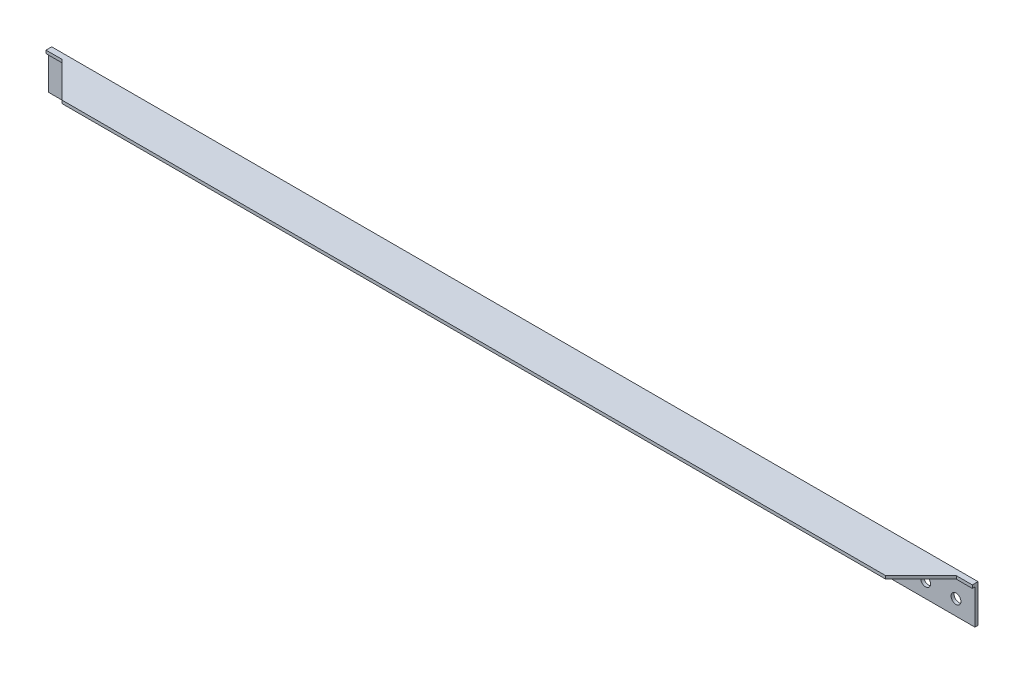
ISO-10303-21;
HEADER;
FILE_DESCRIPTION(('STEP AP214'),'2;1');
FILE_NAME('part.step','',(''),(''),'','','');
FILE_SCHEMA(('AUTOMOTIVE_DESIGN { 1 0 10303 214 1 1 1 1 }'));
ENDSEC;
DATA;
#1=APPLICATION_CONTEXT('core data for automotive mechanical design processes');
#2=APPLICATION_PROTOCOL_DEFINITION('international standard','automotive_design',2000,#1);
#3=PRODUCT_CONTEXT('',#1,'mechanical');
#4=PRODUCT('Part','Part','',(#3));
#5=PRODUCT_RELATED_PRODUCT_CATEGORY('part','',(#4));
#6=PRODUCT_DEFINITION_FORMATION('','',#4);
#7=PRODUCT_DEFINITION_CONTEXT('part definition',#1,'design');
#8=PRODUCT_DEFINITION('design','',#6,#7);
#9=PRODUCT_DEFINITION_SHAPE('','',#8);
#10=(LENGTH_UNIT() NAMED_UNIT(*) SI_UNIT(.MILLI.,.METRE.));
#11=(NAMED_UNIT(*) PLANE_ANGLE_UNIT() SI_UNIT($,.RADIAN.));
#12=(NAMED_UNIT(*) SI_UNIT($,.STERADIAN.) SOLID_ANGLE_UNIT());
#13=UNCERTAINTY_MEASURE_WITH_UNIT(LENGTH_MEASURE(1.E-05),#10,'distance_accuracy_value','');
#14=(GEOMETRIC_REPRESENTATION_CONTEXT(3) GLOBAL_UNCERTAINTY_ASSIGNED_CONTEXT((#13)) GLOBAL_UNIT_ASSIGNED_CONTEXT((#10,
#11,#12)) REPRESENTATION_CONTEXT('',''));
#15=CARTESIAN_POINT('',(0.,0.,0.));
#16=DIRECTION('',(0.,0.,1.));
#17=DIRECTION('',(1.,0.,0.));
#18=AXIS2_PLACEMENT_3D('',#15,#16,#17);
#19=CARTESIAN_POINT('',(-1220.,100.,8.));
#20=DIRECTION('',(0.,0.,-1.));
#21=DIRECTION('',(-1.,0.,0.));
#22=AXIS2_PLACEMENT_3D('',#19,#20,#21);
#23=PLANE('',#22);
#24=CARTESIAN_POINT('',(-80.,39.9999999999999,8.));
#25=DIRECTION('',(0.,0.,1.));
#26=DIRECTION('',(-1.,0.,0.));
#27=AXIS2_PLACEMENT_3D('',#24,#25,#26);
#28=CIRCLE('',#27,13.);
#29=CARTESIAN_POINT('',(-93.,39.9999999999999,8.));
#30=VERTEX_POINT('',#29);
#31=EDGE_CURVE('E144',#30,#30,#28,.T.);
#32=ORIENTED_EDGE('',*,*,#31,.F.);
#33=EDGE_LOOP('',(#32));
#34=FACE_BOUND('',#33,.T.);
#35=CARTESIAN_POINT('',(-160.,39.9999999999999,8.));
#36=DIRECTION('',(0.,0.,1.));
#37=DIRECTION('',(-1.,0.,0.));
#38=AXIS2_PLACEMENT_3D('',#35,#36,#37);
#39=CIRCLE('',#38,13.);
#40=CARTESIAN_POINT('',(-173.,39.9999999999999,8.));
#41=VERTEX_POINT('',#40);
#42=EDGE_CURVE('E150',#41,#41,#39,.T.);
#43=ORIENTED_EDGE('',*,*,#42,.F.);
#44=EDGE_LOOP('',(#43));
#45=FACE_BOUND('',#44,.T.);
#46=CARTESIAN_POINT('',(160.,39.9999999999999,8.));
#47=DIRECTION('',(0.,0.,1.));
#48=DIRECTION('',(1.,0.,0.));
#49=AXIS2_PLACEMENT_3D('',#46,#47,#48);
#50=CIRCLE('',#49,13.);
#51=CARTESIAN_POINT('',(173.,39.9999999999999,8.));
#52=VERTEX_POINT('',#51);
#53=EDGE_CURVE('E156',#52,#52,#50,.T.);
#54=ORIENTED_EDGE('',*,*,#53,.F.);
#55=EDGE_LOOP('',(#54));
#56=FACE_BOUND('',#55,.T.);
#57=CARTESIAN_POINT('',(80.,39.9999999999999,8.));
#58=DIRECTION('',(0.,0.,1.));
#59=DIRECTION('',(1.,0.,0.));
#60=AXIS2_PLACEMENT_3D('',#57,#58,#59);
#61=CIRCLE('',#60,13.);
#62=CARTESIAN_POINT('',(93.,39.9999999999999,8.));
#63=VERTEX_POINT('',#62);
#64=EDGE_CURVE('E162',#63,#63,#61,.T.);
#65=ORIENTED_EDGE('',*,*,#64,.F.);
#66=EDGE_LOOP('',(#65));
#67=FACE_BOUND('',#66,.T.);
#68=CARTESIAN_POINT('',(0.,39.9999999999999,8.));
#69=DIRECTION('',(0.,0.,1.));
#70=DIRECTION('',(1.,0.,0.));
#71=AXIS2_PLACEMENT_3D('',#68,#69,#70);
#72=CIRCLE('',#71,13.);
#73=CARTESIAN_POINT('',(13.,39.9999999999999,8.));
#74=VERTEX_POINT('',#73);
#75=EDGE_CURVE('E168',#74,#74,#72,.T.);
#76=ORIENTED_EDGE('',*,*,#75,.F.);
#77=EDGE_LOOP('',(#76));
#78=FACE_BOUND('',#77,.T.);
#79=CARTESIAN_POINT('',(-1090.,40.,8.));
#80=DIRECTION('',(0.,0.,1.));
#81=DIRECTION('',(-1.,0.,0.));
#82=AXIS2_PLACEMENT_3D('',#79,#80,#81);
#83=CIRCLE('',#82,12.9999999999998);
#84=CARTESIAN_POINT('',(-1103.,40.,8.));
#85=VERTEX_POINT('',#84);
#86=EDGE_CURVE('E174',#85,#85,#83,.T.);
#87=ORIENTED_EDGE('',*,*,#86,.F.);
#88=EDGE_LOOP('',(#87));
#89=FACE_BOUND('',#88,.T.);
#90=CARTESIAN_POINT('',(-1170.,40.,8.));
#91=DIRECTION('',(0.,0.,1.));
#92=DIRECTION('',(-1.,0.,0.));
#93=AXIS2_PLACEMENT_3D('',#90,#91,#92);
#94=CIRCLE('',#93,12.9999999999998);
#95=CARTESIAN_POINT('',(-1183.,40.,8.));
#96=VERTEX_POINT('',#95);
#97=EDGE_CURVE('E180',#96,#96,#94,.T.);
#98=ORIENTED_EDGE('',*,*,#97,.F.);
#99=EDGE_LOOP('',(#98));
#100=FACE_BOUND('',#99,.T.);
#101=CARTESIAN_POINT('',(1170.,40.,8.));
#102=DIRECTION('',(0.,0.,1.));
#103=DIRECTION('',(1.,0.,0.));
#104=AXIS2_PLACEMENT_3D('',#101,#102,#103);
#105=CIRCLE('',#104,12.9999999999998);
#106=CARTESIAN_POINT('',(1183.,40.,8.));
#107=VERTEX_POINT('',#106);
#108=EDGE_CURVE('E186',#107,#107,#105,.T.);
#109=ORIENTED_EDGE('',*,*,#108,.F.);
#110=EDGE_LOOP('',(#109));
#111=FACE_BOUND('',#110,.T.);
#112=CARTESIAN_POINT('',(1090.,40.,8.));
#113=DIRECTION('',(0.,0.,1.));
#114=DIRECTION('',(1.,0.,0.));
#115=AXIS2_PLACEMENT_3D('',#112,#113,#114);
#116=CIRCLE('',#115,12.9999999999998);
#117=CARTESIAN_POINT('',(1103.,40.,8.));
#118=VERTEX_POINT('',#117);
#119=EDGE_CURVE('E192',#118,#118,#116,.T.);
#120=ORIENTED_EDGE('',*,*,#119,.F.);
#121=EDGE_LOOP('',(#120));
#122=FACE_BOUND('',#121,.T.);
#123=DIRECTION('',(1.,0.,0.));
#124=VECTOR('',#123,1.);
#125=CARTESIAN_POINT('',(-1220.,92.,8.));
#126=LINE('',#125,#124);
#127=CARTESIAN_POINT('',(-1220.,92.,8.));
#128=VERTEX_POINT('',#127);
#129=CARTESIAN_POINT('',(1220.,92.,8.));
#130=VERTEX_POINT('',#129);
#131=EDGE_CURVE('E135',#128,#130,#126,.T.);
#132=ORIENTED_EDGE('',*,*,#131,.F.);
#133=DIRECTION('',(0.,-1.,0.));
#134=VECTOR('',#133,1.);
#135=CARTESIAN_POINT('',(-1220.,0.,8.));
#136=LINE('',#135,#134);
#137=CARTESIAN_POINT('',(-1220.,0.,8.));
#138=VERTEX_POINT('',#137);
#139=EDGE_CURVE('E198',#128,#138,#136,.T.);
#140=ORIENTED_EDGE('',*,*,#139,.T.);
#141=DIRECTION('',(1.,0.,0.));
#142=VECTOR('',#141,1.);
#143=CARTESIAN_POINT('',(-1220.,0.,8.));
#144=LINE('',#143,#142);
#145=CARTESIAN_POINT('',(1220.,0.,8.));
#146=VERTEX_POINT('',#145);
#147=EDGE_CURVE('E200',#138,#146,#144,.T.);
#148=ORIENTED_EDGE('',*,*,#147,.T.);
#149=DIRECTION('',(0.,1.,0.));
#150=VECTOR('',#149,1.);
#151=CARTESIAN_POINT('',(1220.,0.,8.));
#152=LINE('',#151,#150);
#153=EDGE_CURVE('E203',#146,#130,#152,.T.);
#154=ORIENTED_EDGE('',*,*,#153,.T.);
#155=EDGE_LOOP('',(#132,#140,#148,#154));
#156=FACE_BOUND('',#155,.T.);
#157=ADVANCED_FACE('F36',(#34,#45,#56,#67,#78,#89,#100,#111,#122,#156),#23,.F.);
#158=CARTESIAN_POINT('',(-1220.,100.,0.));
#159=DIRECTION('',(0.,0.,-1.));
#160=DIRECTION('',(-1.,0.,0.));
#161=AXIS2_PLACEMENT_3D('',#158,#159,#160);
#162=PLANE('',#161);
#163=CARTESIAN_POINT('',(-160.,39.9999999999999,0.));
#164=DIRECTION('',(0.,0.,1.));
#165=DIRECTION('',(-1.,0.,0.));
#166=AXIS2_PLACEMENT_3D('',#163,#164,#165);
#167=CIRCLE('',#166,13.);
#168=CARTESIAN_POINT('',(-173.,39.9999999999999,0.));
#169=VERTEX_POINT('',#168);
#170=EDGE_CURVE('E147',#169,#169,#167,.T.);
#171=ORIENTED_EDGE('',*,*,#170,.T.);
#172=EDGE_LOOP('',(#171));
#173=FACE_BOUND('',#172,.T.);
#174=CARTESIAN_POINT('',(80.,39.9999999999999,0.));
#175=DIRECTION('',(0.,0.,1.));
#176=DIRECTION('',(1.,0.,0.));
#177=AXIS2_PLACEMENT_3D('',#174,#175,#176);
#178=CIRCLE('',#177,13.);
#179=CARTESIAN_POINT('',(93.,39.9999999999999,0.));
#180=VERTEX_POINT('',#179);
#181=EDGE_CURVE('E159',#180,#180,#178,.T.);
#182=ORIENTED_EDGE('',*,*,#181,.T.);
#183=EDGE_LOOP('',(#182));
#184=FACE_BOUND('',#183,.T.);
#185=CARTESIAN_POINT('',(-1090.,40.,0.));
#186=DIRECTION('',(0.,0.,1.));
#187=DIRECTION('',(-1.,0.,0.));
#188=AXIS2_PLACEMENT_3D('',#185,#186,#187);
#189=CIRCLE('',#188,12.9999999999998);
#190=CARTESIAN_POINT('',(-1103.,40.,0.));
#191=VERTEX_POINT('',#190);
#192=EDGE_CURVE('E171',#191,#191,#189,.T.);
#193=ORIENTED_EDGE('',*,*,#192,.T.);
#194=EDGE_LOOP('',(#193));
#195=FACE_BOUND('',#194,.T.);
#196=CARTESIAN_POINT('',(1170.,40.,0.));
#197=DIRECTION('',(0.,0.,1.));
#198=DIRECTION('',(1.,0.,0.));
#199=AXIS2_PLACEMENT_3D('',#196,#197,#198);
#200=CIRCLE('',#199,12.9999999999998);
#201=CARTESIAN_POINT('',(1183.,40.,0.));
#202=VERTEX_POINT('',#201);
#203=EDGE_CURVE('E183',#202,#202,#200,.T.);
#204=ORIENTED_EDGE('',*,*,#203,.T.);
#205=EDGE_LOOP('',(#204));
#206=FACE_BOUND('',#205,.T.);
#207=DIRECTION('',(0.,-1.,0.));
#208=VECTOR('',#207,1.);
#209=CARTESIAN_POINT('',(-1220.,0.,0.));
#210=LINE('',#209,#208);
#211=CARTESIAN_POINT('',(-1220.,100.,0.));
#212=VERTEX_POINT('',#211);
#213=CARTESIAN_POINT('',(-1220.,0.,0.));
#214=VERTEX_POINT('',#213);
#215=EDGE_CURVE('E195',#212,#214,#210,.T.);
#216=ORIENTED_EDGE('',*,*,#215,.F.);
#217=DIRECTION('',(-1.,0.,0.));
#218=VECTOR('',#217,1.);
#219=CARTESIAN_POINT('',(-1220.,100.,0.));
#220=LINE('',#219,#218);
#221=CARTESIAN_POINT('',(1220.,100.,0.));
#222=VERTEX_POINT('',#221);
#223=EDGE_CURVE('E201',#222,#212,#220,.T.);
#224=ORIENTED_EDGE('',*,*,#223,.F.);
#225=DIRECTION('',(0.,1.,0.));
#226=VECTOR('',#225,1.);
#227=CARTESIAN_POINT('',(1220.,0.,0.));
#228=LINE('',#227,#226);
#229=CARTESIAN_POINT('',(1220.,0.,0.));
#230=VERTEX_POINT('',#229);
#231=EDGE_CURVE('E211',#230,#222,#228,.T.);
#232=ORIENTED_EDGE('',*,*,#231,.F.);
#233=DIRECTION('',(1.,0.,0.));
#234=VECTOR('',#233,1.);
#235=CARTESIAN_POINT('',(-1220.,0.,0.));
#236=LINE('',#235,#234);
#237=EDGE_CURVE('E209',#214,#230,#236,.T.);
#238=ORIENTED_EDGE('',*,*,#237,.F.);
#239=EDGE_LOOP('',(#216,#224,#232,#238));
#240=FACE_BOUND('',#239,.T.);
#241=CARTESIAN_POINT('',(1090.,40.,0.));
#242=DIRECTION('',(0.,0.,1.));
#243=DIRECTION('',(1.,0.,0.));
#244=AXIS2_PLACEMENT_3D('',#241,#242,#243);
#245=CIRCLE('',#244,12.9999999999998);
#246=CARTESIAN_POINT('',(1103.,40.,0.));
#247=VERTEX_POINT('',#246);
#248=EDGE_CURVE('E189',#247,#247,#245,.T.);
#249=ORIENTED_EDGE('',*,*,#248,.T.);
#250=EDGE_LOOP('',(#249));
#251=FACE_BOUND('',#250,.T.);
#252=CARTESIAN_POINT('',(-1170.,40.,0.));
#253=DIRECTION('',(0.,0.,1.));
#254=DIRECTION('',(-1.,0.,0.));
#255=AXIS2_PLACEMENT_3D('',#252,#253,#254);
#256=CIRCLE('',#255,12.9999999999998);
#257=CARTESIAN_POINT('',(-1183.,40.,0.));
#258=VERTEX_POINT('',#257);
#259=EDGE_CURVE('E177',#258,#258,#256,.T.);
#260=ORIENTED_EDGE('',*,*,#259,.T.);
#261=EDGE_LOOP('',(#260));
#262=FACE_BOUND('',#261,.T.);
#263=CARTESIAN_POINT('',(0.,39.9999999999999,0.));
#264=DIRECTION('',(0.,0.,1.));
#265=DIRECTION('',(1.,0.,0.));
#266=AXIS2_PLACEMENT_3D('',#263,#264,#265);
#267=CIRCLE('',#266,13.);
#268=CARTESIAN_POINT('',(13.,39.9999999999999,0.));
#269=VERTEX_POINT('',#268);
#270=EDGE_CURVE('E165',#269,#269,#267,.T.);
#271=ORIENTED_EDGE('',*,*,#270,.T.);
#272=EDGE_LOOP('',(#271));
#273=FACE_BOUND('',#272,.T.);
#274=CARTESIAN_POINT('',(160.,39.9999999999999,0.));
#275=DIRECTION('',(0.,0.,1.));
#276=DIRECTION('',(1.,0.,0.));
#277=AXIS2_PLACEMENT_3D('',#274,#275,#276);
#278=CIRCLE('',#277,13.);
#279=CARTESIAN_POINT('',(173.,39.9999999999999,0.));
#280=VERTEX_POINT('',#279);
#281=EDGE_CURVE('E153',#280,#280,#278,.T.);
#282=ORIENTED_EDGE('',*,*,#281,.T.);
#283=EDGE_LOOP('',(#282));
#284=FACE_BOUND('',#283,.T.);
#285=CARTESIAN_POINT('',(-80.,39.9999999999999,0.));
#286=DIRECTION('',(0.,0.,1.));
#287=DIRECTION('',(-1.,0.,0.));
#288=AXIS2_PLACEMENT_3D('',#285,#286,#287);
#289=CIRCLE('',#288,13.);
#290=CARTESIAN_POINT('',(-93.,39.9999999999999,0.));
#291=VERTEX_POINT('',#290);
#292=EDGE_CURVE('E143',#291,#291,#289,.T.);
#293=ORIENTED_EDGE('',*,*,#292,.T.);
#294=EDGE_LOOP('',(#293));
#295=FACE_BOUND('',#294,.T.);
#296=ADVANCED_FACE('F264',(#173,#184,#195,#206,#240,#251,#262,#273,#284,#295),#162,.T.);
#297=CARTESIAN_POINT('',(-1220.,0.,8.));
#298=DIRECTION('',(1.,0.,0.));
#299=DIRECTION('',(0.,0.,-1.));
#300=AXIS2_PLACEMENT_3D('',#297,#298,#299);
#301=PLANE('',#300);
#302=DIRECTION('',(0.,0.,-1.));
#303=VECTOR('',#302,1.);
#304=CARTESIAN_POINT('',(-1220.,92.,108.));
#305=LINE('',#304,#303);
#306=CARTESIAN_POINT('',(-1220.,92.,15.));
#307=VERTEX_POINT('',#306);
#308=EDGE_CURVE('E133',#307,#128,#305,.T.);
#309=ORIENTED_EDGE('',*,*,#308,.F.);
#310=DIRECTION('',(0.,1.,0.));
#311=VECTOR('',#310,1.);
#312=CARTESIAN_POINT('',(-1220.,0.,15.));
#313=LINE('',#312,#311);
#314=CARTESIAN_POINT('',(-1220.,100.,15.));
#315=VERTEX_POINT('',#314);
#316=EDGE_CURVE('E250',#307,#315,#313,.T.);
#317=ORIENTED_EDGE('',*,*,#316,.T.);
#318=DIRECTION('',(0.,0.,-1.));
#319=VECTOR('',#318,1.);
#320=CARTESIAN_POINT('',(-1220.,100.,8.));
#321=LINE('',#320,#319);
#322=EDGE_CURVE('E206',#315,#212,#321,.T.);
#323=ORIENTED_EDGE('',*,*,#322,.T.);
#324=ORIENTED_EDGE('',*,*,#215,.T.);
#325=DIRECTION('',(0.,0.,-1.));
#326=VECTOR('',#325,1.);
#327=CARTESIAN_POINT('',(-1220.,0.,8.));
#328=LINE('',#327,#326);
#329=EDGE_CURVE('E222',#138,#214,#328,.T.);
#330=ORIENTED_EDGE('',*,*,#329,.F.);
#331=ORIENTED_EDGE('',*,*,#139,.F.);
#332=EDGE_LOOP('',(#309,#317,#323,#324,#330,#331));
#333=FACE_BOUND('',#332,.T.);
#334=ADVANCED_FACE('F38',(#333),#301,.F.);
#335=CARTESIAN_POINT('',(-1220.,0.,8.));
#336=DIRECTION('',(0.,1.,0.));
#337=DIRECTION('',(0.,0.,1.));
#338=AXIS2_PLACEMENT_3D('',#335,#336,#337);
#339=PLANE('',#338);
#340=ORIENTED_EDGE('',*,*,#237,.T.);
#341=DIRECTION('',(0.,0.,-1.));
#342=VECTOR('',#341,1.);
#343=CARTESIAN_POINT('',(1220.,0.,8.));
#344=LINE('',#343,#342);
#345=EDGE_CURVE('E219',#146,#230,#344,.T.);
#346=ORIENTED_EDGE('',*,*,#345,.F.);
#347=ORIENTED_EDGE('',*,*,#147,.F.);
#348=ORIENTED_EDGE('',*,*,#329,.T.);
#349=EDGE_LOOP('',(#340,#346,#347,#348));
#350=FACE_BOUND('',#349,.T.);
#351=ADVANCED_FACE('F269',(#350),#339,.F.);
#352=CARTESIAN_POINT('',(1220.,0.,8.));
#353=DIRECTION('',(-1.,0.,0.));
#354=DIRECTION('',(0.,0.,1.));
#355=AXIS2_PLACEMENT_3D('',#352,#353,#354);
#356=PLANE('',#355);
#357=DIRECTION('',(0.,0.,-1.));
#358=VECTOR('',#357,1.);
#359=CARTESIAN_POINT('',(1220.,100.,8.));
#360=LINE('',#359,#358);
#361=CARTESIAN_POINT('',(1220.,100.,15.));
#362=VERTEX_POINT('',#361);
#363=EDGE_CURVE('E217',#362,#222,#360,.T.);
#364=ORIENTED_EDGE('',*,*,#363,.F.);
#365=DIRECTION('',(0.,1.,0.));
#366=VECTOR('',#365,1.);
#367=CARTESIAN_POINT('',(1220.,0.,15.));
#368=LINE('',#367,#366);
#369=CARTESIAN_POINT('',(1220.,92.,15.));
#370=VERTEX_POINT('',#369);
#371=EDGE_CURVE('E236',#370,#362,#368,.T.);
#372=ORIENTED_EDGE('',*,*,#371,.F.);
#373=DIRECTION('',(0.,0.,-1.));
#374=VECTOR('',#373,1.);
#375=CARTESIAN_POINT('',(1220.,92.,108.));
#376=LINE('',#375,#374);
#377=EDGE_CURVE('E130',#370,#130,#376,.T.);
#378=ORIENTED_EDGE('',*,*,#377,.T.);
#379=ORIENTED_EDGE('',*,*,#153,.F.);
#380=ORIENTED_EDGE('',*,*,#345,.T.);
#381=ORIENTED_EDGE('',*,*,#231,.T.);
#382=EDGE_LOOP('',(#364,#372,#378,#379,#380,#381));
#383=FACE_BOUND('',#382,.T.);
#384=ADVANCED_FACE('F241',(#383),#356,.F.);
#385=CARTESIAN_POINT('',(-1220.,100.,8.));
#386=DIRECTION('',(0.,-1.,0.));
#387=DIRECTION('',(0.,0.,-1.));
#388=AXIS2_PLACEMENT_3D('',#385,#386,#387);
#389=PLANE('',#388);
#390=ORIENTED_EDGE('',*,*,#322,.F.);
#391=DIRECTION('',(-1.,0.,0.));
#392=VECTOR('',#391,1.);
#393=CARTESIAN_POINT('',(-1220.,100.,15.));
#394=LINE('',#393,#392);
#395=CARTESIAN_POINT('',(-1178.,100.,15.));
#396=VERTEX_POINT('',#395);
#397=EDGE_CURVE('E126',#396,#315,#394,.T.);
#398=ORIENTED_EDGE('',*,*,#397,.F.);
#399=DIRECTION('',(-0.707106781186552,0.,-0.707106781186543));
#400=VECTOR('',#399,1.);
#401=CARTESIAN_POINT('',(-1085.,100.,108.));
#402=LINE('',#401,#400);
#403=CARTESIAN_POINT('',(-1085.,100.,108.));
#404=VERTEX_POINT('',#403);
#405=EDGE_CURVE('E115',#404,#396,#402,.T.);
#406=ORIENTED_EDGE('',*,*,#405,.F.);
#407=DIRECTION('',(-1.,0.,0.));
#408=VECTOR('',#407,1.);
#409=CARTESIAN_POINT('',(-1220.,100.,108.));
#410=LINE('',#409,#408);
#411=CARTESIAN_POINT('',(1085.,100.,108.));
#412=VERTEX_POINT('',#411);
#413=EDGE_CURVE('E125',#412,#404,#410,.T.);
#414=ORIENTED_EDGE('',*,*,#413,.F.);
#415=DIRECTION('',(-0.707106781186551,0.,0.707106781186544));
#416=VECTOR('',#415,1.);
#417=CARTESIAN_POINT('',(1085.,100.,108.));
#418=LINE('',#417,#416);
#419=CARTESIAN_POINT('',(1178.,100.,15.));
#420=VERTEX_POINT('',#419);
#421=EDGE_CURVE('E59',#420,#412,#418,.T.);
#422=ORIENTED_EDGE('',*,*,#421,.F.);
#423=DIRECTION('',(-1.,0.,0.));
#424=VECTOR('',#423,1.);
#425=CARTESIAN_POINT('',(1220.,100.,15.));
#426=LINE('',#425,#424);
#427=EDGE_CURVE('E245',#362,#420,#426,.T.);
#428=ORIENTED_EDGE('',*,*,#427,.F.);
#429=ORIENTED_EDGE('',*,*,#363,.T.);
#430=ORIENTED_EDGE('',*,*,#223,.T.);
#431=EDGE_LOOP('',(#390,#398,#406,#414,#422,#428,#429,#430));
#432=FACE_BOUND('',#431,.T.);
#433=ADVANCED_FACE('F124',(#432),#389,.F.);
#434=CARTESIAN_POINT('',(1090.,40.,8.));
#435=DIRECTION('',(0.,0.,-1.));
#436=DIRECTION('',(-1.,0.,0.));
#437=AXIS2_PLACEMENT_3D('',#434,#435,#436);
#438=CYLINDRICAL_SURFACE('',#437,12.9999999999998);
#439=ORIENTED_EDGE('',*,*,#119,.T.);
#440=EDGE_LOOP('',(#439));
#441=FACE_BOUND('',#440,.T.);
#442=ORIENTED_EDGE('',*,*,#248,.F.);
#443=EDGE_LOOP('',(#442));
#444=FACE_BOUND('',#443,.T.);
#445=ADVANCED_FACE('F294',(#441,#444),#438,.F.);
#446=CARTESIAN_POINT('',(1170.,40.,8.));
#447=DIRECTION('',(0.,0.,-1.));
#448=DIRECTION('',(-1.,0.,0.));
#449=AXIS2_PLACEMENT_3D('',#446,#447,#448);
#450=CYLINDRICAL_SURFACE('',#449,12.9999999999998);
#451=ORIENTED_EDGE('',*,*,#108,.T.);
#452=EDGE_LOOP('',(#451));
#453=FACE_BOUND('',#452,.T.);
#454=ORIENTED_EDGE('',*,*,#203,.F.);
#455=EDGE_LOOP('',(#454));
#456=FACE_BOUND('',#455,.T.);
#457=ADVANCED_FACE('F326',(#453,#456),#450,.F.);
#458=CARTESIAN_POINT('',(-1170.,40.,8.));
#459=DIRECTION('',(0.,0.,-1.));
#460=DIRECTION('',(-1.,0.,0.));
#461=AXIS2_PLACEMENT_3D('',#458,#459,#460);
#462=CYLINDRICAL_SURFACE('',#461,12.9999999999998);
#463=ORIENTED_EDGE('',*,*,#97,.T.);
#464=EDGE_LOOP('',(#463));
#465=FACE_BOUND('',#464,.T.);
#466=ORIENTED_EDGE('',*,*,#259,.F.);
#467=EDGE_LOOP('',(#466));
#468=FACE_BOUND('',#467,.T.);
#469=ADVANCED_FACE('F336',(#465,#468),#462,.F.);
#470=CARTESIAN_POINT('',(-1090.,40.,8.));
#471=DIRECTION('',(0.,0.,-1.));
#472=DIRECTION('',(-1.,0.,0.));
#473=AXIS2_PLACEMENT_3D('',#470,#471,#472);
#474=CYLINDRICAL_SURFACE('',#473,12.9999999999998);
#475=ORIENTED_EDGE('',*,*,#86,.T.);
#476=EDGE_LOOP('',(#475));
#477=FACE_BOUND('',#476,.T.);
#478=ORIENTED_EDGE('',*,*,#192,.F.);
#479=EDGE_LOOP('',(#478));
#480=FACE_BOUND('',#479,.T.);
#481=ADVANCED_FACE('F345',(#477,#480),#474,.F.);
#482=CARTESIAN_POINT('',(0.,39.9999999999999,8.));
#483=DIRECTION('',(0.,0.,-1.));
#484=DIRECTION('',(-1.,0.,0.));
#485=AXIS2_PLACEMENT_3D('',#482,#483,#484);
#486=CYLINDRICAL_SURFACE('',#485,13.);
#487=ORIENTED_EDGE('',*,*,#75,.T.);
#488=EDGE_LOOP('',(#487));
#489=FACE_BOUND('',#488,.T.);
#490=ORIENTED_EDGE('',*,*,#270,.F.);
#491=EDGE_LOOP('',(#490));
#492=FACE_BOUND('',#491,.T.);
#493=ADVANCED_FACE('F355',(#489,#492),#486,.F.);
#494=CARTESIAN_POINT('',(80.,39.9999999999999,8.));
#495=DIRECTION('',(0.,0.,-1.));
#496=DIRECTION('',(-1.,0.,0.));
#497=AXIS2_PLACEMENT_3D('',#494,#495,#496);
#498=CYLINDRICAL_SURFACE('',#497,13.);
#499=ORIENTED_EDGE('',*,*,#64,.T.);
#500=EDGE_LOOP('',(#499));
#501=FACE_BOUND('',#500,.T.);
#502=ORIENTED_EDGE('',*,*,#181,.F.);
#503=EDGE_LOOP('',(#502));
#504=FACE_BOUND('',#503,.T.);
#505=ADVANCED_FACE('F365',(#501,#504),#498,.F.);
#506=CARTESIAN_POINT('',(160.,39.9999999999999,8.));
#507=DIRECTION('',(0.,0.,-1.));
#508=DIRECTION('',(-1.,0.,0.));
#509=AXIS2_PLACEMENT_3D('',#506,#507,#508);
#510=CYLINDRICAL_SURFACE('',#509,13.);
#511=ORIENTED_EDGE('',*,*,#53,.T.);
#512=EDGE_LOOP('',(#511));
#513=FACE_BOUND('',#512,.T.);
#514=ORIENTED_EDGE('',*,*,#281,.F.);
#515=EDGE_LOOP('',(#514));
#516=FACE_BOUND('',#515,.T.);
#517=ADVANCED_FACE('F375',(#513,#516),#510,.F.);
#518=CARTESIAN_POINT('',(-160.,39.9999999999999,8.));
#519=DIRECTION('',(0.,0.,-1.));
#520=DIRECTION('',(-1.,0.,0.));
#521=AXIS2_PLACEMENT_3D('',#518,#519,#520);
#522=CYLINDRICAL_SURFACE('',#521,13.);
#523=ORIENTED_EDGE('',*,*,#42,.T.);
#524=EDGE_LOOP('',(#523));
#525=FACE_BOUND('',#524,.T.);
#526=ORIENTED_EDGE('',*,*,#170,.F.);
#527=EDGE_LOOP('',(#526));
#528=FACE_BOUND('',#527,.T.);
#529=ADVANCED_FACE('F385',(#525,#528),#522,.F.);
#530=CARTESIAN_POINT('',(-80.,39.9999999999999,8.));
#531=DIRECTION('',(0.,0.,-1.));
#532=DIRECTION('',(-1.,0.,0.));
#533=AXIS2_PLACEMENT_3D('',#530,#531,#532);
#534=CYLINDRICAL_SURFACE('',#533,13.);
#535=ORIENTED_EDGE('',*,*,#31,.T.);
#536=EDGE_LOOP('',(#535));
#537=FACE_BOUND('',#536,.T.);
#538=ORIENTED_EDGE('',*,*,#292,.F.);
#539=EDGE_LOOP('',(#538));
#540=FACE_BOUND('',#539,.T.);
#541=ADVANCED_FACE('F395',(#537,#540),#534,.F.);
#542=CARTESIAN_POINT('',(-1220.,92.,108.));
#543=DIRECTION('',(0.,1.,0.));
#544=DIRECTION('',(0.,0.,1.));
#545=AXIS2_PLACEMENT_3D('',#542,#543,#544);
#546=PLANE('',#545);
#547=DIRECTION('',(-0.707106781186552,0.,-0.707106781186543));
#548=VECTOR('',#547,1.);
#549=CARTESIAN_POINT('',(-1152.5,92.,40.5));
#550=LINE('',#549,#548);
#551=CARTESIAN_POINT('',(-1085.,92.,108.));
#552=VERTEX_POINT('',#551);
#553=CARTESIAN_POINT('',(-1178.,92.,15.));
#554=VERTEX_POINT('',#553);
#555=EDGE_CURVE('E51',#552,#554,#550,.T.);
#556=ORIENTED_EDGE('',*,*,#555,.T.);
#557=DIRECTION('',(-1.,0.,0.));
#558=VECTOR('',#557,1.);
#559=CARTESIAN_POINT('',(-1220.,92.,15.));
#560=LINE('',#559,#558);
#561=EDGE_CURVE('E11',#554,#307,#560,.T.);
#562=ORIENTED_EDGE('',*,*,#561,.T.);
#563=ORIENTED_EDGE('',*,*,#308,.T.);
#564=ORIENTED_EDGE('',*,*,#131,.T.);
#565=ORIENTED_EDGE('',*,*,#377,.F.);
#566=DIRECTION('',(-1.,0.,0.));
#567=VECTOR('',#566,1.);
#568=CARTESIAN_POINT('',(-1220.,92.,15.0000000000007));
#569=LINE('',#568,#567);
#570=CARTESIAN_POINT('',(1178.,92.,15.));
#571=VERTEX_POINT('',#570);
#572=EDGE_CURVE('E120',#370,#571,#569,.T.);
#573=ORIENTED_EDGE('',*,*,#572,.T.);
#574=DIRECTION('',(-0.707106781186551,0.,0.707106781186544));
#575=VECTOR('',#574,1.);
#576=CARTESIAN_POINT('',(-67.5000000000108,92.,1260.5));
#577=LINE('',#576,#575);
#578=CARTESIAN_POINT('',(1085.,92.,108.));
#579=VERTEX_POINT('',#578);
#580=EDGE_CURVE('E140',#571,#579,#577,.T.);
#581=ORIENTED_EDGE('',*,*,#580,.T.);
#582=DIRECTION('',(1.,0.,0.));
#583=VECTOR('',#582,1.);
#584=CARTESIAN_POINT('',(-1220.,92.,108.));
#585=LINE('',#584,#583);
#586=EDGE_CURVE('E131',#552,#579,#585,.T.);
#587=ORIENTED_EDGE('',*,*,#586,.F.);
#588=EDGE_LOOP('',(#556,#562,#563,#564,#565,#573,#581,#587));
#589=FACE_BOUND('',#588,.T.);
#590=ADVANCED_FACE('F230',(#589),#546,.F.);
#591=CARTESIAN_POINT('',(-1220.,92.,108.));
#592=DIRECTION('',(0.,0.,1.));
#593=DIRECTION('',(1.,0.,0.));
#594=AXIS2_PLACEMENT_3D('',#591,#592,#593);
#595=PLANE('',#594);
#596=DIRECTION('',(0.,1.,0.));
#597=VECTOR('',#596,1.);
#598=CARTESIAN_POINT('',(-1085.,92.,108.));
#599=LINE('',#598,#597);
#600=EDGE_CURVE('E44',#552,#404,#599,.T.);
#601=ORIENTED_EDGE('',*,*,#600,.F.);
#602=ORIENTED_EDGE('',*,*,#586,.T.);
#603=DIRECTION('',(0.,-1.,0.));
#604=VECTOR('',#603,1.);
#605=CARTESIAN_POINT('',(1085.,92.,108.));
#606=LINE('',#605,#604);
#607=EDGE_CURVE('E129',#412,#579,#606,.T.);
#608=ORIENTED_EDGE('',*,*,#607,.F.);
#609=ORIENTED_EDGE('',*,*,#413,.T.);
#610=EDGE_LOOP('',(#601,#602,#608,#609));
#611=FACE_BOUND('',#610,.T.);
#612=ADVANCED_FACE('F128',(#611),#595,.T.);
#613=CARTESIAN_POINT('',(1220.,0.,15.));
#614=DIRECTION('',(0.,0.,-1.));
#615=DIRECTION('',(-1.,0.,0.));
#616=AXIS2_PLACEMENT_3D('',#613,#614,#615);
#617=PLANE('',#616);
#618=ORIENTED_EDGE('',*,*,#371,.T.);
#619=ORIENTED_EDGE('',*,*,#427,.T.);
#620=DIRECTION('',(0.,1.,0.));
#621=VECTOR('',#620,1.);
#622=CARTESIAN_POINT('',(1178.,0.,15.));
#623=LINE('',#622,#621);
#624=EDGE_CURVE('E238',#571,#420,#623,.T.);
#625=ORIENTED_EDGE('',*,*,#624,.F.);
#626=ORIENTED_EDGE('',*,*,#572,.F.);
#627=EDGE_LOOP('',(#618,#619,#625,#626));
#628=FACE_BOUND('',#627,.T.);
#629=ADVANCED_FACE('F234',(#628),#617,.F.);
#630=CARTESIAN_POINT('',(1085.,0.,108.));
#631=DIRECTION('',(-0.707106781186544,0.,-0.707106781186551));
#632=DIRECTION('',(-0.707106781186551,0.,0.707106781186544));
#633=AXIS2_PLACEMENT_3D('',#630,#631,#632);
#634=PLANE('',#633);
#635=ORIENTED_EDGE('',*,*,#624,.T.);
#636=ORIENTED_EDGE('',*,*,#421,.T.);
#637=ORIENTED_EDGE('',*,*,#607,.T.);
#638=ORIENTED_EDGE('',*,*,#580,.F.);
#639=EDGE_LOOP('',(#635,#636,#637,#638));
#640=FACE_BOUND('',#639,.T.);
#641=ADVANCED_FACE('F273',(#640),#634,.F.);
#642=CARTESIAN_POINT('',(-1220.,0.,15.));
#643=DIRECTION('',(0.,0.,-1.));
#644=DIRECTION('',(-1.,0.,0.));
#645=AXIS2_PLACEMENT_3D('',#642,#643,#644);
#646=PLANE('',#645);
#647=DIRECTION('',(0.,1.,0.));
#648=VECTOR('',#647,1.);
#649=CARTESIAN_POINT('',(-1178.,0.,15.));
#650=LINE('',#649,#648);
#651=EDGE_CURVE('E251',#554,#396,#650,.T.);
#652=ORIENTED_EDGE('',*,*,#651,.T.);
#653=ORIENTED_EDGE('',*,*,#397,.T.);
#654=ORIENTED_EDGE('',*,*,#316,.F.);
#655=ORIENTED_EDGE('',*,*,#561,.F.);
#656=EDGE_LOOP('',(#652,#653,#654,#655));
#657=FACE_BOUND('',#656,.T.);
#658=ADVANCED_FACE('F256',(#657),#646,.F.);
#659=CARTESIAN_POINT('',(-1085.,0.,108.));
#660=DIRECTION('',(0.707106781186543,0.,-0.707106781186552));
#661=DIRECTION('',(-0.707106781186552,0.,-0.707106781186543));
#662=AXIS2_PLACEMENT_3D('',#659,#660,#661);
#663=PLANE('',#662);
#664=ORIENTED_EDGE('',*,*,#600,.T.);
#665=ORIENTED_EDGE('',*,*,#405,.T.);
#666=ORIENTED_EDGE('',*,*,#651,.F.);
#667=ORIENTED_EDGE('',*,*,#555,.F.);
#668=EDGE_LOOP('',(#664,#665,#666,#667));
#669=FACE_BOUND('',#668,.T.);
#670=ADVANCED_FACE('F114',(#669),#663,.F.);
#671=CLOSED_SHELL('',(#157,#296,#334,#351,#384,#433,#445,#457,#469,#481,#493,#505,#517,#529,
#541,#590,#612,#629,#641,#658,#670));
#672=MANIFOLD_SOLID_BREP('B2',#671);
#673=ADVANCED_BREP_SHAPE_REPRESENTATION('',(#18,#672),#14);
#674=SHAPE_DEFINITION_REPRESENTATION(#9,#673);
ENDSEC;
END-ISO-10303-21;
